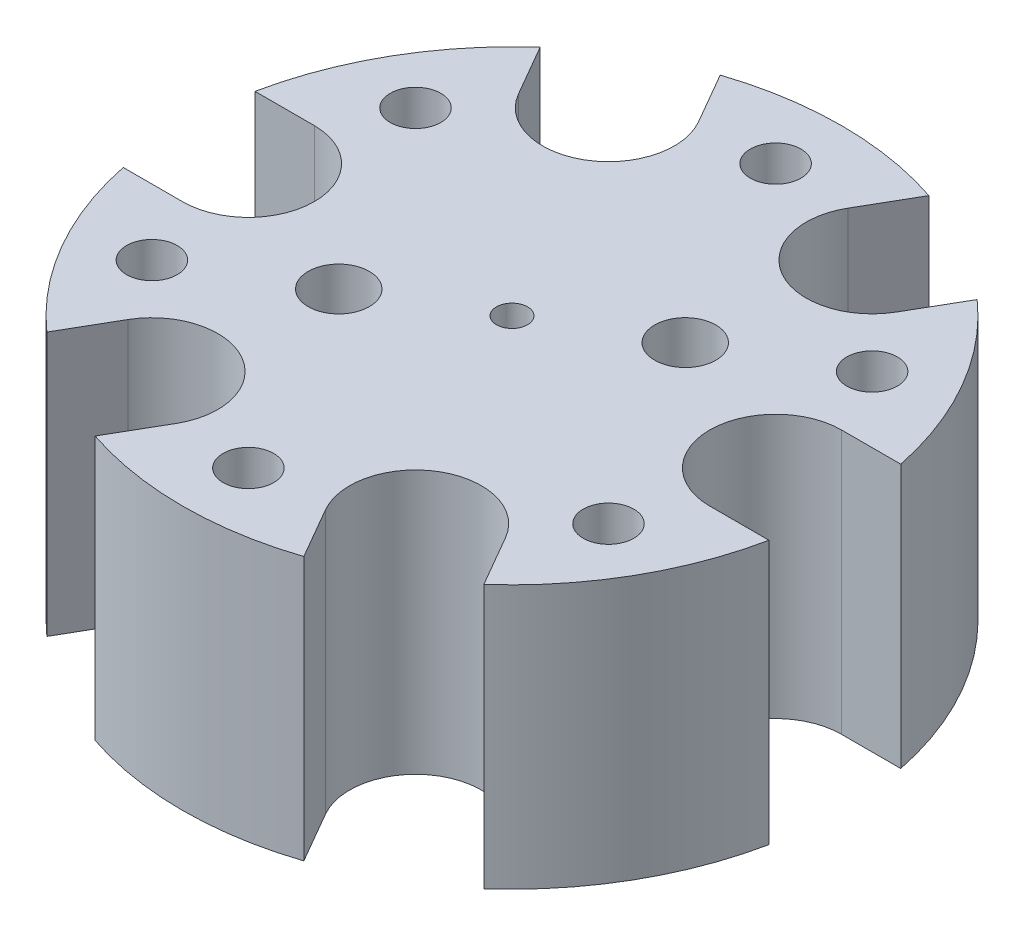
ISO-10303-21;
HEADER;
FILE_DESCRIPTION(('STEP AP214'),'2;1');
FILE_NAME('part.step','',(''),(''),'','','');
FILE_SCHEMA(('AUTOMOTIVE_DESIGN { 1 0 10303 214 1 1 1 1 }'));
ENDSEC;
DATA;
#1=APPLICATION_CONTEXT('core data for automotive mechanical design processes');
#2=APPLICATION_PROTOCOL_DEFINITION('international standard','automotive_design',2000,#1);
#3=PRODUCT_CONTEXT('',#1,'mechanical');
#4=PRODUCT('Part','Part','',(#3));
#5=PRODUCT_RELATED_PRODUCT_CATEGORY('part','',(#4));
#6=PRODUCT_DEFINITION_FORMATION('','',#4);
#7=PRODUCT_DEFINITION_CONTEXT('part definition',#1,'design');
#8=PRODUCT_DEFINITION('design','',#6,#7);
#9=PRODUCT_DEFINITION_SHAPE('','',#8);
#10=(LENGTH_UNIT() NAMED_UNIT(*) SI_UNIT(.MILLI.,.METRE.));
#11=(NAMED_UNIT(*) PLANE_ANGLE_UNIT() SI_UNIT($,.RADIAN.));
#12=(NAMED_UNIT(*) SI_UNIT($,.STERADIAN.) SOLID_ANGLE_UNIT());
#13=UNCERTAINTY_MEASURE_WITH_UNIT(LENGTH_MEASURE(1.E-05),#10,'distance_accuracy_value','');
#14=(GEOMETRIC_REPRESENTATION_CONTEXT(3) GLOBAL_UNCERTAINTY_ASSIGNED_CONTEXT((#13)) GLOBAL_UNIT_ASSIGNED_CONTEXT((#10,
#11,#12)) REPRESENTATION_CONTEXT('',''));
#15=CARTESIAN_POINT('',(0.,0.,0.));
#16=DIRECTION('',(0.,0.,1.));
#17=DIRECTION('',(1.,0.,0.));
#18=AXIS2_PLACEMENT_3D('',#15,#16,#17);
#19=CARTESIAN_POINT('',(0.,12.7,0.));
#20=DIRECTION('',(0.,-1.,0.));
#21=DIRECTION('',(0.,0.,-1.));
#22=AXIS2_PLACEMENT_3D('',#19,#20,#21);
#23=CYLINDRICAL_SURFACE('',#22,15.875);
#24=DIRECTION('',(0.,-1.,0.));
#25=VECTOR('',#24,1.);
#26=CARTESIAN_POINT('',(5.02749927632117,12.7,-15.0578841816037));
#27=LINE('',#26,#25);
#28=CARTESIAN_POINT('',(5.02749927632117,0.,-15.0578841816037));
#29=VERTEX_POINT('',#28);
#30=CARTESIAN_POINT('',(5.02749927632117,12.7,-15.0578841816037));
#31=VERTEX_POINT('',#30);
#32=EDGE_CURVE('E214',#29,#31,#27,.F.);
#33=ORIENTED_EDGE('',*,*,#32,.F.);
#34=CARTESIAN_POINT('',(0.,0.,0.));
#35=DIRECTION('',(0.,1.,0.));
#36=DIRECTION('',(0.,0.,1.));
#37=AXIS2_PLACEMENT_3D('',#34,#35,#36);
#38=CIRCLE('',#37,15.875);
#39=CARTESIAN_POINT('',(-5.02749927632086,0.,-15.0578841816038));
#40=VERTEX_POINT('',#39);
#41=EDGE_CURVE('E425',#29,#40,#38,.T.);
#42=ORIENTED_EDGE('',*,*,#41,.T.);
#43=DIRECTION('',(0.,-1.,0.));
#44=VECTOR('',#43,1.);
#45=CARTESIAN_POINT('',(-5.02749927632086,12.7,-15.0578841816038));
#46=LINE('',#45,#44);
#47=CARTESIAN_POINT('',(-5.02749927632086,12.7,-15.0578841816038));
#48=VERTEX_POINT('',#47);
#49=EDGE_CURVE('E258',#40,#48,#46,.F.);
#50=ORIENTED_EDGE('',*,*,#49,.T.);
#51=CARTESIAN_POINT('',(0.,12.7,0.));
#52=DIRECTION('',(0.,1.,0.));
#53=DIRECTION('',(0.,0.,1.));
#54=AXIS2_PLACEMENT_3D('',#51,#52,#53);
#55=CIRCLE('',#54,15.875);
#56=EDGE_CURVE('E419',#31,#48,#55,.T.);
#57=ORIENTED_EDGE('',*,*,#56,.F.);
#58=EDGE_LOOP('',(#33,#42,#50,#57));
#59=FACE_BOUND('',#58,.T.);
#60=ADVANCED_FACE('F38',(#59),#23,.T.);
#61=DIRECTION('',(0.,-1.,0.));
#62=VECTOR('',#61,1.);
#63=CARTESIAN_POINT('',(-10.5267605903521,12.7,-11.8828841816038));
#64=LINE('',#63,#62);
#65=CARTESIAN_POINT('',(-10.5267605903521,0.,-11.8828841816038));
#66=VERTEX_POINT('',#65);
#67=CARTESIAN_POINT('',(-10.5267605903521,12.7,-11.8828841816038));
#68=VERTEX_POINT('',#67);
#69=EDGE_CURVE('E253',#66,#68,#64,.F.);
#70=ORIENTED_EDGE('',*,*,#69,.F.);
#71=CARTESIAN_POINT('',(-15.5542598666732,0.,-3.175));
#72=VERTEX_POINT('',#71);
#73=EDGE_CURVE('E530',#66,#72,#38,.T.);
#74=ORIENTED_EDGE('',*,*,#73,.T.);
#75=DIRECTION('',(0.,-1.,0.));
#76=VECTOR('',#75,1.);
#77=CARTESIAN_POINT('',(-15.5542598666732,12.7,-3.175));
#78=LINE('',#77,#76);
#79=CARTESIAN_POINT('',(-15.5542598666732,12.7,-3.175));
#80=VERTEX_POINT('',#79);
#81=EDGE_CURVE('E283',#72,#80,#78,.F.);
#82=ORIENTED_EDGE('',*,*,#81,.T.);
#83=EDGE_CURVE('E495',#68,#80,#55,.T.);
#84=ORIENTED_EDGE('',*,*,#83,.F.);
#85=EDGE_LOOP('',(#70,#74,#82,#84));
#86=FACE_BOUND('',#85,.T.);
#87=ADVANCED_FACE('F541',(#86),#23,.T.);
#88=DIRECTION('',(0.,-1.,0.));
#89=VECTOR('',#88,1.);
#90=CARTESIAN_POINT('',(-15.5542598666732,12.7,3.175));
#91=LINE('',#90,#89);
#92=CARTESIAN_POINT('',(-15.5542598666732,0.,3.175));
#93=VERTEX_POINT('',#92);
#94=CARTESIAN_POINT('',(-15.5542598666732,12.7,3.175));
#95=VERTEX_POINT('',#94);
#96=EDGE_CURVE('E278',#93,#95,#91,.F.);
#97=ORIENTED_EDGE('',*,*,#96,.F.);
#98=CARTESIAN_POINT('',(-10.5267605903522,0.,11.8828841816037));
#99=VERTEX_POINT('',#98);
#100=EDGE_CURVE('E524',#93,#99,#38,.T.);
#101=ORIENTED_EDGE('',*,*,#100,.T.);
#102=DIRECTION('',(0.,-1.,0.));
#103=VECTOR('',#102,1.);
#104=CARTESIAN_POINT('',(-10.5267605903522,12.7,11.8828841816037));
#105=LINE('',#104,#103);
#106=CARTESIAN_POINT('',(-10.5267605903522,12.7,11.8828841816037));
#107=VERTEX_POINT('',#106);
#108=EDGE_CURVE('E308',#99,#107,#105,.F.);
#109=ORIENTED_EDGE('',*,*,#108,.T.);
#110=EDGE_CURVE('E497',#95,#107,#55,.T.);
#111=ORIENTED_EDGE('',*,*,#110,.F.);
#112=EDGE_LOOP('',(#97,#101,#109,#111));
#113=FACE_BOUND('',#112,.T.);
#114=ADVANCED_FACE('F553',(#113),#23,.T.);
#115=DIRECTION('',(0.,-1.,0.));
#116=VECTOR('',#115,1.);
#117=CARTESIAN_POINT('',(-5.02749927632107,12.7,15.0578841816037));
#118=LINE('',#117,#116);
#119=CARTESIAN_POINT('',(-5.02749927632107,0.,15.0578841816037));
#120=VERTEX_POINT('',#119);
#121=CARTESIAN_POINT('',(-5.02749927632107,12.7,15.0578841816037));
#122=VERTEX_POINT('',#121);
#123=EDGE_CURVE('E303',#120,#122,#118,.F.);
#124=ORIENTED_EDGE('',*,*,#123,.F.);
#125=CARTESIAN_POINT('',(5.02749927632096,0.,15.0578841816037));
#126=VERTEX_POINT('',#125);
#127=EDGE_CURVE('E522',#120,#126,#38,.T.);
#128=ORIENTED_EDGE('',*,*,#127,.T.);
#129=DIRECTION('',(0.,-1.,0.));
#130=VECTOR('',#129,1.);
#131=CARTESIAN_POINT('',(5.02749927632096,12.7,15.0578841816037));
#132=LINE('',#131,#130);
#133=CARTESIAN_POINT('',(5.02749927632096,12.7,15.0578841816037));
#134=VERTEX_POINT('',#133);
#135=EDGE_CURVE('E333',#126,#134,#132,.F.);
#136=ORIENTED_EDGE('',*,*,#135,.T.);
#137=EDGE_CURVE('E501',#122,#134,#55,.T.);
#138=ORIENTED_EDGE('',*,*,#137,.F.);
#139=EDGE_LOOP('',(#124,#128,#136,#138));
#140=FACE_BOUND('',#139,.T.);
#141=ADVANCED_FACE('F564',(#140),#23,.T.);
#142=DIRECTION('',(0.,-1.,0.));
#143=VECTOR('',#142,1.);
#144=CARTESIAN_POINT('',(10.5267605903522,12.7,11.8828841816038));
#145=LINE('',#144,#143);
#146=CARTESIAN_POINT('',(10.5267605903522,0.,11.8828841816038));
#147=VERTEX_POINT('',#146);
#148=CARTESIAN_POINT('',(10.5267605903522,12.7,11.8828841816038));
#149=VERTEX_POINT('',#148);
#150=EDGE_CURVE('E328',#147,#149,#145,.F.);
#151=ORIENTED_EDGE('',*,*,#150,.F.);
#152=CARTESIAN_POINT('',(15.5542598666732,0.,3.175));
#153=VERTEX_POINT('',#152);
#154=EDGE_CURVE('E426',#147,#153,#38,.T.);
#155=ORIENTED_EDGE('',*,*,#154,.T.);
#156=DIRECTION('',(0.,-1.,0.));
#157=VECTOR('',#156,1.);
#158=CARTESIAN_POINT('',(15.5542598666732,12.7,3.175));
#159=LINE('',#158,#157);
#160=CARTESIAN_POINT('',(15.5542598666732,12.7,3.175));
#161=VERTEX_POINT('',#160);
#162=EDGE_CURVE('E398',#153,#161,#159,.F.);
#163=ORIENTED_EDGE('',*,*,#162,.T.);
#164=EDGE_CURVE('E420',#149,#161,#55,.T.);
#165=ORIENTED_EDGE('',*,*,#164,.F.);
#166=EDGE_LOOP('',(#151,#155,#163,#165));
#167=FACE_BOUND('',#166,.T.);
#168=ADVANCED_FACE('F518',(#167),#23,.T.);
#169=CARTESIAN_POINT('',(15.5542598666732,0.,-3.175));
#170=VERTEX_POINT('',#169);
#171=CARTESIAN_POINT('',(10.5267605903523,0.,-11.8828841816036));
#172=VERTEX_POINT('',#171);
#173=EDGE_CURVE('E421',#170,#172,#38,.T.);
#174=ORIENTED_EDGE('',*,*,#173,.T.);
#175=DIRECTION('',(0.,-1.,0.));
#176=VECTOR('',#175,1.);
#177=CARTESIAN_POINT('',(10.5267605903523,12.7,-11.8828841816036));
#178=LINE('',#177,#176);
#179=CARTESIAN_POINT('',(10.5267605903523,12.7,-11.8828841816036));
#180=VERTEX_POINT('',#179);
#181=EDGE_CURVE('E235',#172,#180,#178,.F.);
#182=ORIENTED_EDGE('',*,*,#181,.T.);
#183=CARTESIAN_POINT('',(15.5542598666732,12.7,-3.175));
#184=VERTEX_POINT('',#183);
#185=EDGE_CURVE('E415',#184,#180,#55,.T.);
#186=ORIENTED_EDGE('',*,*,#185,.F.);
#187=DIRECTION('',(0.,-1.,0.));
#188=VECTOR('',#187,1.);
#189=CARTESIAN_POINT('',(15.5542598666732,12.7,-3.175));
#190=LINE('',#189,#188);
#191=EDGE_CURVE('E393',#170,#184,#190,.F.);
#192=ORIENTED_EDGE('',*,*,#191,.F.);
#193=EDGE_LOOP('',(#174,#182,#186,#192));
#194=FACE_BOUND('',#193,.T.);
#195=ADVANCED_FACE('F40',(#194),#23,.T.);
#196=CARTESIAN_POINT('',(0.,12.7,0.));
#197=DIRECTION('',(0.,1.,0.));
#198=DIRECTION('',(0.,0.,1.));
#199=AXIS2_PLACEMENT_3D('',#196,#197,#198);
#200=PLANE('',#199);
#201=CARTESIAN_POINT('',(-5.29141521712296,12.7,3.05499999999993));
#202=DIRECTION('',(0.,-1.,0.));
#203=DIRECTION('',(0.,0.,-1.));
#204=AXIS2_PLACEMENT_3D('',#201,#202,#203);
#205=CIRCLE('',#204,1.4732);
#206=CARTESIAN_POINT('',(-5.29141521712296,12.7,1.58179999999993));
#207=VERTEX_POINT('',#206);
#208=EDGE_CURVE('E735',#207,#207,#205,.T.);
#209=ORIENTED_EDGE('',*,*,#208,.T.);
#210=EDGE_LOOP('',(#209));
#211=FACE_BOUND('',#210,.T.);
#212=CARTESIAN_POINT('',(5.29141521712292,12.7,-3.05500000000001));
#213=DIRECTION('',(0.,-1.,0.));
#214=DIRECTION('',(0.,0.,-1.));
#215=AXIS2_PLACEMENT_3D('',#212,#213,#214);
#216=CIRCLE('',#215,1.4732);
#217=CARTESIAN_POINT('',(5.29141521712292,12.7,-4.52820000000001));
#218=VERTEX_POINT('',#217);
#219=EDGE_CURVE('E218',#218,#218,#216,.T.);
#220=ORIENTED_EDGE('',*,*,#219,.T.);
#221=EDGE_LOOP('',(#220));
#222=FACE_BOUND('',#221,.T.);
#223=DIRECTION('',(0.50000000000001,0.,-0.866025403784433));
#224=VECTOR('',#223,1.);
#225=CARTESIAN_POINT('',(2.74963065701558,12.7,1.58750000000003));
#226=LINE('',#225,#224);
#227=CARTESIAN_POINT('',(9.0996306570157,12.7,-9.41102262806226));
#228=VERTEX_POINT('',#227);
#229=EDGE_CURVE('E208',#228,#180,#226,.T.);
#230=ORIENTED_EDGE('',*,*,#229,.F.);
#231=CARTESIAN_POINT('',(6.35000000000013,12.7,-10.9985226280623));
#232=DIRECTION('',(0.,1.,0.));
#233=DIRECTION('',(0.866025403784433,0.,0.50000000000001));
#234=AXIS2_PLACEMENT_3D('',#231,#232,#233);
#235=CIRCLE('',#234,3.175);
#236=CARTESIAN_POINT('',(3.60036934298455,12.7,-12.5860226280623));
#237=VERTEX_POINT('',#236);
#238=EDGE_CURVE('E202',#237,#228,#235,.T.);
#239=ORIENTED_EDGE('',*,*,#238,.F.);
#240=DIRECTION('',(0.50000000000001,0.,-0.866025403784433));
#241=VECTOR('',#240,1.);
#242=CARTESIAN_POINT('',(-2.74963065701558,12.7,-1.58750000000003));
#243=LINE('',#242,#241);
#244=EDGE_CURVE('E211',#237,#31,#243,.T.);
#245=ORIENTED_EDGE('',*,*,#244,.T.);
#246=ORIENTED_EDGE('',*,*,#56,.T.);
#247=DIRECTION('',(-0.499999999999992,0.,-0.866025403784443));
#248=VECTOR('',#247,1.);
#249=CARTESIAN_POINT('',(2.74963065701561,12.7,-1.58749999999997));
#250=LINE('',#249,#248);
#251=CARTESIAN_POINT('',(-3.60036934298429,12.7,-12.5860226280624));
#252=VERTEX_POINT('',#251);
#253=EDGE_CURVE('E247',#252,#48,#250,.T.);
#254=ORIENTED_EDGE('',*,*,#253,.F.);
#255=CARTESIAN_POINT('',(-6.3499999999999,12.7,-10.9985226280624));
#256=DIRECTION('',(0.,1.,0.));
#257=DIRECTION('',(0.866025403784443,0.,-0.499999999999992));
#258=AXIS2_PLACEMENT_3D('',#255,#256,#257);
#259=CIRCLE('',#258,3.175);
#260=CARTESIAN_POINT('',(-9.0996306570155,12.7,-9.41102262806245));
#261=VERTEX_POINT('',#260);
#262=EDGE_CURVE('E243',#261,#252,#259,.T.);
#263=ORIENTED_EDGE('',*,*,#262,.F.);
#264=DIRECTION('',(-0.499999999999992,0.,-0.866025403784443));
#265=VECTOR('',#264,1.);
#266=CARTESIAN_POINT('',(-2.74963065701561,12.7,1.58749999999997));
#267=LINE('',#266,#265);
#268=EDGE_CURVE('E239',#261,#68,#267,.T.);
#269=ORIENTED_EDGE('',*,*,#268,.T.);
#270=ORIENTED_EDGE('',*,*,#83,.T.);
#271=DIRECTION('',(-1.,0.,0.));
#272=VECTOR('',#271,1.);
#273=CARTESIAN_POINT('',(0.,12.7,-3.175));
#274=LINE('',#273,#272);
#275=CARTESIAN_POINT('',(-12.7,12.7,-3.175));
#276=VERTEX_POINT('',#275);
#277=EDGE_CURVE('E270',#276,#80,#274,.T.);
#278=ORIENTED_EDGE('',*,*,#277,.F.);
#279=CARTESIAN_POINT('',(-12.7,12.7,0.));
#280=DIRECTION('',(0.,1.,0.));
#281=DIRECTION('',(0.,0.,-1.));
#282=AXIS2_PLACEMENT_3D('',#279,#280,#281);
#283=CIRCLE('',#282,3.175);
#284=CARTESIAN_POINT('',(-12.7,12.7,3.175));
#285=VERTEX_POINT('',#284);
#286=EDGE_CURVE('E266',#285,#276,#283,.T.);
#287=ORIENTED_EDGE('',*,*,#286,.F.);
#288=DIRECTION('',(-1.,0.,0.));
#289=VECTOR('',#288,1.);
#290=CARTESIAN_POINT('',(0.,12.7,3.175));
#291=LINE('',#290,#289);
#292=EDGE_CURVE('E262',#285,#95,#291,.T.);
#293=ORIENTED_EDGE('',*,*,#292,.T.);
#294=ORIENTED_EDGE('',*,*,#110,.T.);
#295=DIRECTION('',(-0.500000000000004,0.,0.866025403784436));
#296=VECTOR('',#295,1.);
#297=CARTESIAN_POINT('',(-2.74963065701559,12.7,-1.58750000000001));
#298=LINE('',#297,#296);
#299=CARTESIAN_POINT('',(-9.09963065701564,12.7,9.41102262806233));
#300=VERTEX_POINT('',#299);
#301=EDGE_CURVE('E295',#300,#107,#298,.T.);
#302=ORIENTED_EDGE('',*,*,#301,.F.);
#303=CARTESIAN_POINT('',(-6.35000000000005,12.7,10.9985226280623));
#304=DIRECTION('',(0.,1.,0.));
#305=DIRECTION('',(-0.866025403784436,0.,-0.500000000000004));
#306=AXIS2_PLACEMENT_3D('',#303,#304,#305);
#307=CIRCLE('',#306,3.175);
#308=CARTESIAN_POINT('',(-3.60036934298446,12.7,12.5860226280624));
#309=VERTEX_POINT('',#308);
#310=EDGE_CURVE('E291',#309,#300,#307,.T.);
#311=ORIENTED_EDGE('',*,*,#310,.F.);
#312=DIRECTION('',(-0.500000000000004,0.,0.866025403784436));
#313=VECTOR('',#312,1.);
#314=CARTESIAN_POINT('',(2.74963065701559,12.7,1.58750000000001));
#315=LINE('',#314,#313);
#316=EDGE_CURVE('E287',#309,#122,#315,.T.);
#317=ORIENTED_EDGE('',*,*,#316,.T.);
#318=ORIENTED_EDGE('',*,*,#137,.T.);
#319=DIRECTION('',(0.499999999999998,0.,0.86602540378444));
#320=VECTOR('',#319,1.);
#321=CARTESIAN_POINT('',(-2.7496306570156,12.7,1.5875));
#322=LINE('',#321,#320);
#323=CARTESIAN_POINT('',(3.60036934298438,12.7,12.5860226280624));
#324=VERTEX_POINT('',#323);
#325=EDGE_CURVE('E320',#324,#134,#322,.T.);
#326=ORIENTED_EDGE('',*,*,#325,.F.);
#327=CARTESIAN_POINT('',(6.34999999999997,12.7,10.9985226280624));
#328=DIRECTION('',(0.,1.,0.));
#329=DIRECTION('',(-0.86602540378444,0.,0.499999999999998));
#330=AXIS2_PLACEMENT_3D('',#327,#328,#329);
#331=CIRCLE('',#330,3.175);
#332=CARTESIAN_POINT('',(9.09963065701557,12.7,9.41102262806239));
#333=VERTEX_POINT('',#332);
#334=EDGE_CURVE('E316',#333,#324,#331,.T.);
#335=ORIENTED_EDGE('',*,*,#334,.F.);
#336=DIRECTION('',(0.499999999999998,0.,0.86602540378444));
#337=VECTOR('',#336,1.);
#338=CARTESIAN_POINT('',(2.7496306570156,12.7,-1.5875));
#339=LINE('',#338,#337);
#340=EDGE_CURVE('E312',#333,#149,#339,.T.);
#341=ORIENTED_EDGE('',*,*,#340,.T.);
#342=ORIENTED_EDGE('',*,*,#164,.T.);
#343=DIRECTION('',(1.,0.,0.));
#344=VECTOR('',#343,1.);
#345=CARTESIAN_POINT('',(0.,12.7,3.175));
#346=LINE('',#345,#344);
#347=CARTESIAN_POINT('',(12.7,12.7,3.175));
#348=VERTEX_POINT('',#347);
#349=EDGE_CURVE('E385',#348,#161,#346,.T.);
#350=ORIENTED_EDGE('',*,*,#349,.F.);
#351=CARTESIAN_POINT('',(12.7,12.7,0.));
#352=DIRECTION('',(0.,1.,0.));
#353=DIRECTION('',(0.,0.,1.));
#354=AXIS2_PLACEMENT_3D('',#351,#352,#353);
#355=CIRCLE('',#354,3.175);
#356=CARTESIAN_POINT('',(12.7,12.7,-3.175));
#357=VERTEX_POINT('',#356);
#358=EDGE_CURVE('E381',#357,#348,#355,.T.);
#359=ORIENTED_EDGE('',*,*,#358,.F.);
#360=DIRECTION('',(1.,0.,0.));
#361=VECTOR('',#360,1.);
#362=CARTESIAN_POINT('',(0.,12.7,-3.175));
#363=LINE('',#362,#361);
#364=EDGE_CURVE('E374',#357,#184,#363,.T.);
#365=ORIENTED_EDGE('',*,*,#364,.T.);
#366=ORIENTED_EDGE('',*,*,#185,.T.);
#367=EDGE_LOOP('',(#230,#239,#245,#246,#254,#263,#269,#270,#278,#287,#293,#294,#302,#311,#317,
#318,#326,#335,#341,#342,#350,#359,#365,#366));
#368=FACE_BOUND('',#367,.T.);
#369=CARTESIAN_POINT('',(-10.9985226280623,12.7,-6.35000000000013));
#370=DIRECTION('',(0.,1.,0.));
#371=DIRECTION('',(0.866025403784433,0.,0.50000000000001));
#372=AXIS2_PLACEMENT_3D('',#369,#370,#371);
#373=CIRCLE('',#372,1.2192);
#374=CARTESIAN_POINT('',(-9.94266445576832,12.7,-5.74040000000012));
#375=VERTEX_POINT('',#374);
#376=EDGE_CURVE('E337',#375,#375,#373,.T.);
#377=ORIENTED_EDGE('',*,*,#376,.F.);
#378=EDGE_LOOP('',(#377));
#379=FACE_BOUND('',#378,.T.);
#380=CARTESIAN_POINT('',(-10.9985226280624,12.7,6.3499999999999));
#381=DIRECTION('',(0.,1.,0.));
#382=DIRECTION('',(0.866025403784443,0.,-0.499999999999992));
#383=AXIS2_PLACEMENT_3D('',#380,#381,#382);
#384=CIRCLE('',#383,1.2192);
#385=CARTESIAN_POINT('',(-9.94266445576844,12.7,5.74039999999991));
#386=VERTEX_POINT('',#385);
#387=EDGE_CURVE('E342',#386,#386,#384,.T.);
#388=ORIENTED_EDGE('',*,*,#387,.F.);
#389=EDGE_LOOP('',(#388));
#390=FACE_BOUND('',#389,.T.);
#391=CARTESIAN_POINT('',(0.,12.7,12.7));
#392=DIRECTION('',(0.,1.,0.));
#393=DIRECTION('',(0.,0.,-1.));
#394=AXIS2_PLACEMENT_3D('',#391,#392,#393);
#395=CIRCLE('',#394,1.2192);
#396=CARTESIAN_POINT('',(0.,12.7,11.4808));
#397=VERTEX_POINT('',#396);
#398=EDGE_CURVE('E350',#397,#397,#395,.T.);
#399=ORIENTED_EDGE('',*,*,#398,.F.);
#400=EDGE_LOOP('',(#399));
#401=FACE_BOUND('',#400,.T.);
#402=CARTESIAN_POINT('',(10.9985226280623,12.7,6.35000000000005));
#403=DIRECTION('',(0.,1.,0.));
#404=DIRECTION('',(-0.866025403784436,0.,-0.500000000000004));
#405=AXIS2_PLACEMENT_3D('',#402,#403,#404);
#406=CIRCLE('',#405,1.2192);
#407=CARTESIAN_POINT('',(9.94266445576836,12.7,5.74040000000005));
#408=VERTEX_POINT('',#407);
#409=EDGE_CURVE('E358',#408,#408,#406,.T.);
#410=ORIENTED_EDGE('',*,*,#409,.F.);
#411=EDGE_LOOP('',(#410));
#412=FACE_BOUND('',#411,.T.);
#413=CARTESIAN_POINT('',(10.9985226280624,12.7,-6.34999999999997));
#414=DIRECTION('',(0.,1.,0.));
#415=DIRECTION('',(-0.86602540378444,0.,0.499999999999998));
#416=AXIS2_PLACEMENT_3D('',#413,#414,#415);
#417=CIRCLE('',#416,1.2192);
#418=CARTESIAN_POINT('',(9.9426644557684,12.7,-5.74039999999998));
#419=VERTEX_POINT('',#418);
#420=EDGE_CURVE('E366',#419,#419,#417,.T.);
#421=ORIENTED_EDGE('',*,*,#420,.F.);
#422=EDGE_LOOP('',(#421));
#423=FACE_BOUND('',#422,.T.);
#424=CARTESIAN_POINT('',(0.,12.7,-12.7));
#425=DIRECTION('',(0.,1.,0.));
#426=DIRECTION('',(0.,0.,1.));
#427=AXIS2_PLACEMENT_3D('',#424,#425,#426);
#428=CIRCLE('',#427,1.2192);
#429=CARTESIAN_POINT('',(0.,12.7,-11.4808));
#430=VERTEX_POINT('',#429);
#431=EDGE_CURVE('E402',#430,#430,#428,.T.);
#432=ORIENTED_EDGE('',*,*,#431,.F.);
#433=EDGE_LOOP('',(#432));
#434=FACE_BOUND('',#433,.T.);
#435=CARTESIAN_POINT('',(0.,12.7,0.));
#436=DIRECTION('',(0.,1.,0.));
#437=DIRECTION('',(0.,0.,1.));
#438=AXIS2_PLACEMENT_3D('',#435,#436,#437);
#439=CIRCLE('',#438,0.7493);
#440=CARTESIAN_POINT('',(0.,12.7,0.7493));
#441=VERTEX_POINT('',#440);
#442=EDGE_CURVE('E407',#441,#441,#439,.T.);
#443=ORIENTED_EDGE('',*,*,#442,.F.);
#444=EDGE_LOOP('',(#443));
#445=FACE_BOUND('',#444,.T.);
#446=ADVANCED_FACE('F220',(#211,#222,#368,#379,#390,#401,#412,#423,#434,#445),#200,.T.);
#447=CARTESIAN_POINT('',(0.,0.,0.));
#448=DIRECTION('',(0.,1.,0.));
#449=DIRECTION('',(0.,0.,1.));
#450=AXIS2_PLACEMENT_3D('',#447,#448,#449);
#451=PLANE('',#450);
#452=CARTESIAN_POINT('',(-5.29141521712296,0.,3.05499999999993));
#453=DIRECTION('',(0.,-1.,0.));
#454=DIRECTION('',(0.,0.,-1.));
#455=AXIS2_PLACEMENT_3D('',#452,#453,#454);
#456=CIRCLE('',#455,1.47319999999999);
#457=CARTESIAN_POINT('',(-5.29141521712296,0.,1.58179999999994));
#458=VERTEX_POINT('',#457);
#459=EDGE_CURVE('E628',#458,#458,#456,.T.);
#460=ORIENTED_EDGE('',*,*,#459,.F.);
#461=EDGE_LOOP('',(#460));
#462=FACE_BOUND('',#461,.T.);
#463=CARTESIAN_POINT('',(5.29141521712292,0.,-3.05500000000001));
#464=DIRECTION('',(0.,-1.,0.));
#465=DIRECTION('',(0.,0.,-1.));
#466=AXIS2_PLACEMENT_3D('',#463,#464,#465);
#467=CIRCLE('',#466,1.47319999999999);
#468=CARTESIAN_POINT('',(5.29141521712292,0.,-4.5282));
#469=VERTEX_POINT('',#468);
#470=EDGE_CURVE('E632',#469,#469,#467,.T.);
#471=ORIENTED_EDGE('',*,*,#470,.F.);
#472=EDGE_LOOP('',(#471));
#473=FACE_BOUND('',#472,.T.);
#474=CARTESIAN_POINT('',(-10.9985226280623,0.,-6.35000000000013));
#475=DIRECTION('',(0.,1.,0.));
#476=DIRECTION('',(0.866025403784433,0.,0.50000000000001));
#477=AXIS2_PLACEMENT_3D('',#474,#475,#476);
#478=CIRCLE('',#477,1.2192);
#479=CARTESIAN_POINT('',(-9.94266445576832,0.,-5.74040000000012));
#480=VERTEX_POINT('',#479);
#481=EDGE_CURVE('E338',#480,#480,#478,.T.);
#482=ORIENTED_EDGE('',*,*,#481,.T.);
#483=EDGE_LOOP('',(#482));
#484=FACE_BOUND('',#483,.T.);
#485=CARTESIAN_POINT('',(-10.9985226280624,0.,6.3499999999999));
#486=DIRECTION('',(0.,1.,0.));
#487=DIRECTION('',(0.866025403784443,0.,-0.499999999999992));
#488=AXIS2_PLACEMENT_3D('',#485,#486,#487);
#489=CIRCLE('',#488,1.2192);
#490=CARTESIAN_POINT('',(-9.94266445576844,0.,5.74039999999991));
#491=VERTEX_POINT('',#490);
#492=EDGE_CURVE('E346',#491,#491,#489,.T.);
#493=ORIENTED_EDGE('',*,*,#492,.T.);
#494=EDGE_LOOP('',(#493));
#495=FACE_BOUND('',#494,.T.);
#496=CARTESIAN_POINT('',(0.,0.,12.7));
#497=DIRECTION('',(0.,1.,0.));
#498=DIRECTION('',(0.,0.,-1.));
#499=AXIS2_PLACEMENT_3D('',#496,#497,#498);
#500=CIRCLE('',#499,1.2192);
#501=CARTESIAN_POINT('',(0.,0.,11.4808));
#502=VERTEX_POINT('',#501);
#503=EDGE_CURVE('E354',#502,#502,#500,.T.);
#504=ORIENTED_EDGE('',*,*,#503,.T.);
#505=EDGE_LOOP('',(#504));
#506=FACE_BOUND('',#505,.T.);
#507=CARTESIAN_POINT('',(10.9985226280623,0.,6.35000000000005));
#508=DIRECTION('',(0.,1.,0.));
#509=DIRECTION('',(-0.866025403784436,0.,-0.500000000000004));
#510=AXIS2_PLACEMENT_3D('',#507,#508,#509);
#511=CIRCLE('',#510,1.2192);
#512=CARTESIAN_POINT('',(9.94266445576836,0.,5.74040000000005));
#513=VERTEX_POINT('',#512);
#514=EDGE_CURVE('E362',#513,#513,#511,.T.);
#515=ORIENTED_EDGE('',*,*,#514,.T.);
#516=EDGE_LOOP('',(#515));
#517=FACE_BOUND('',#516,.T.);
#518=CARTESIAN_POINT('',(10.9985226280624,0.,-6.34999999999997));
#519=DIRECTION('',(0.,1.,0.));
#520=DIRECTION('',(-0.86602540378444,0.,0.499999999999998));
#521=AXIS2_PLACEMENT_3D('',#518,#519,#520);
#522=CIRCLE('',#521,1.2192);
#523=CARTESIAN_POINT('',(9.9426644557684,0.,-5.74039999999998));
#524=VERTEX_POINT('',#523);
#525=EDGE_CURVE('E370',#524,#524,#522,.T.);
#526=ORIENTED_EDGE('',*,*,#525,.T.);
#527=EDGE_LOOP('',(#526));
#528=FACE_BOUND('',#527,.T.);
#529=CARTESIAN_POINT('',(0.,0.,-12.7));
#530=DIRECTION('',(0.,1.,0.));
#531=DIRECTION('',(0.,0.,1.));
#532=AXIS2_PLACEMENT_3D('',#529,#530,#531);
#533=CIRCLE('',#532,1.2192);
#534=CARTESIAN_POINT('',(0.,0.,-11.4808));
#535=VERTEX_POINT('',#534);
#536=EDGE_CURVE('E403',#535,#535,#533,.T.);
#537=ORIENTED_EDGE('',*,*,#536,.T.);
#538=EDGE_LOOP('',(#537));
#539=FACE_BOUND('',#538,.T.);
#540=CARTESIAN_POINT('',(0.,0.,0.));
#541=DIRECTION('',(0.,1.,0.));
#542=DIRECTION('',(0.,0.,1.));
#543=AXIS2_PLACEMENT_3D('',#540,#541,#542);
#544=CIRCLE('',#543,0.7493);
#545=CARTESIAN_POINT('',(0.,0.,0.7493));
#546=VERTEX_POINT('',#545);
#547=EDGE_CURVE('E414',#546,#546,#544,.T.);
#548=ORIENTED_EDGE('',*,*,#547,.T.);
#549=EDGE_LOOP('',(#548));
#550=FACE_BOUND('',#549,.T.);
#551=CARTESIAN_POINT('',(6.35000000000013,0.,-10.9985226280623));
#552=DIRECTION('',(0.,1.,0.));
#553=DIRECTION('',(0.,0.,1.));
#554=AXIS2_PLACEMENT_3D('',#551,#552,#553);
#555=CIRCLE('',#554,3.175);
#556=CARTESIAN_POINT('',(3.60036934298455,0.,-12.5860226280623));
#557=VERTEX_POINT('',#556);
#558=CARTESIAN_POINT('',(9.0996306570157,0.,-9.41102262806226));
#559=VERTEX_POINT('',#558);
#560=EDGE_CURVE('E47',#557,#559,#555,.T.);
#561=ORIENTED_EDGE('',*,*,#560,.T.);
#562=DIRECTION('',(0.50000000000001,0.,-0.866025403784433));
#563=VECTOR('',#562,1.);
#564=CARTESIAN_POINT('',(2.74963065701558,0.,1.58750000000003));
#565=LINE('',#564,#563);
#566=EDGE_CURVE('E11',#559,#172,#565,.T.);
#567=ORIENTED_EDGE('',*,*,#566,.T.);
#568=ORIENTED_EDGE('',*,*,#173,.F.);
#569=DIRECTION('',(1.,0.,0.));
#570=VECTOR('',#569,1.);
#571=CARTESIAN_POINT('',(0.,0.,-3.175));
#572=LINE('',#571,#570);
#573=CARTESIAN_POINT('',(12.7,0.,-3.175));
#574=VERTEX_POINT('',#573);
#575=EDGE_CURVE('E418',#574,#170,#572,.T.);
#576=ORIENTED_EDGE('',*,*,#575,.F.);
#577=CARTESIAN_POINT('',(12.7,0.,0.));
#578=DIRECTION('',(0.,1.,0.));
#579=DIRECTION('',(0.,0.,1.));
#580=AXIS2_PLACEMENT_3D('',#577,#578,#579);
#581=CIRCLE('',#580,3.175);
#582=CARTESIAN_POINT('',(12.7,0.,3.175));
#583=VERTEX_POINT('',#582);
#584=EDGE_CURVE('E432',#574,#583,#581,.T.);
#585=ORIENTED_EDGE('',*,*,#584,.T.);
#586=DIRECTION('',(1.,0.,0.));
#587=VECTOR('',#586,1.);
#588=CARTESIAN_POINT('',(0.,0.,3.175));
#589=LINE('',#588,#587);
#590=EDGE_CURVE('E436',#583,#153,#589,.T.);
#591=ORIENTED_EDGE('',*,*,#590,.T.);
#592=ORIENTED_EDGE('',*,*,#154,.F.);
#593=DIRECTION('',(0.499999999999998,0.,0.86602540378444));
#594=VECTOR('',#593,1.);
#595=CARTESIAN_POINT('',(2.7496306570156,0.,-1.5875));
#596=LINE('',#595,#594);
#597=CARTESIAN_POINT('',(9.09963065701557,0.,9.41102262806239));
#598=VERTEX_POINT('',#597);
#599=EDGE_CURVE('E440',#598,#147,#596,.T.);
#600=ORIENTED_EDGE('',*,*,#599,.F.);
#601=CARTESIAN_POINT('',(6.34999999999997,0.,10.9985226280624));
#602=DIRECTION('',(0.,1.,0.));
#603=DIRECTION('',(0.,0.,1.));
#604=AXIS2_PLACEMENT_3D('',#601,#602,#603);
#605=CIRCLE('',#604,3.175);
#606=CARTESIAN_POINT('',(3.60036934298438,0.,12.5860226280624));
#607=VERTEX_POINT('',#606);
#608=EDGE_CURVE('E443',#598,#607,#605,.T.);
#609=ORIENTED_EDGE('',*,*,#608,.T.);
#610=DIRECTION('',(0.499999999999998,0.,0.86602540378444));
#611=VECTOR('',#610,1.);
#612=CARTESIAN_POINT('',(-2.7496306570156,0.,1.5875));
#613=LINE('',#612,#611);
#614=EDGE_CURVE('E447',#607,#126,#613,.T.);
#615=ORIENTED_EDGE('',*,*,#614,.T.);
#616=ORIENTED_EDGE('',*,*,#127,.F.);
#617=DIRECTION('',(-0.500000000000004,0.,0.866025403784436));
#618=VECTOR('',#617,1.);
#619=CARTESIAN_POINT('',(2.74963065701559,0.,1.58750000000001));
#620=LINE('',#619,#618);
#621=CARTESIAN_POINT('',(-3.60036934298446,0.,12.5860226280624));
#622=VERTEX_POINT('',#621);
#623=EDGE_CURVE('E451',#622,#120,#620,.T.);
#624=ORIENTED_EDGE('',*,*,#623,.F.);
#625=CARTESIAN_POINT('',(-6.35000000000005,0.,10.9985226280623));
#626=DIRECTION('',(0.,1.,0.));
#627=DIRECTION('',(0.,0.,1.));
#628=AXIS2_PLACEMENT_3D('',#625,#626,#627);
#629=CIRCLE('',#628,3.175);
#630=CARTESIAN_POINT('',(-9.09963065701564,0.,9.41102262806233));
#631=VERTEX_POINT('',#630);
#632=EDGE_CURVE('E454',#622,#631,#629,.T.);
#633=ORIENTED_EDGE('',*,*,#632,.T.);
#634=DIRECTION('',(-0.500000000000004,0.,0.866025403784436));
#635=VECTOR('',#634,1.);
#636=CARTESIAN_POINT('',(-2.74963065701559,0.,-1.58750000000001));
#637=LINE('',#636,#635);
#638=EDGE_CURVE('E458',#631,#99,#637,.T.);
#639=ORIENTED_EDGE('',*,*,#638,.T.);
#640=ORIENTED_EDGE('',*,*,#100,.F.);
#641=DIRECTION('',(-1.,0.,0.));
#642=VECTOR('',#641,1.);
#643=CARTESIAN_POINT('',(0.,0.,3.175));
#644=LINE('',#643,#642);
#645=CARTESIAN_POINT('',(-12.7,0.,3.175));
#646=VERTEX_POINT('',#645);
#647=EDGE_CURVE('E462',#646,#93,#644,.T.);
#648=ORIENTED_EDGE('',*,*,#647,.F.);
#649=CARTESIAN_POINT('',(-12.7,0.,0.));
#650=DIRECTION('',(0.,1.,0.));
#651=DIRECTION('',(0.,0.,1.));
#652=AXIS2_PLACEMENT_3D('',#649,#650,#651);
#653=CIRCLE('',#652,3.175);
#654=CARTESIAN_POINT('',(-12.7,0.,-3.175));
#655=VERTEX_POINT('',#654);
#656=EDGE_CURVE('E465',#646,#655,#653,.T.);
#657=ORIENTED_EDGE('',*,*,#656,.T.);
#658=DIRECTION('',(-1.,0.,0.));
#659=VECTOR('',#658,1.);
#660=CARTESIAN_POINT('',(0.,0.,-3.175));
#661=LINE('',#660,#659);
#662=EDGE_CURVE('E469',#655,#72,#661,.T.);
#663=ORIENTED_EDGE('',*,*,#662,.T.);
#664=ORIENTED_EDGE('',*,*,#73,.F.);
#665=DIRECTION('',(-0.499999999999992,0.,-0.866025403784443));
#666=VECTOR('',#665,1.);
#667=CARTESIAN_POINT('',(-2.74963065701561,0.,1.58749999999997));
#668=LINE('',#667,#666);
#669=CARTESIAN_POINT('',(-9.0996306570155,0.,-9.41102262806245));
#670=VERTEX_POINT('',#669);
#671=EDGE_CURVE('E473',#670,#66,#668,.T.);
#672=ORIENTED_EDGE('',*,*,#671,.F.);
#673=CARTESIAN_POINT('',(-6.3499999999999,0.,-10.9985226280624));
#674=DIRECTION('',(0.,1.,0.));
#675=DIRECTION('',(0.,0.,1.));
#676=AXIS2_PLACEMENT_3D('',#673,#674,#675);
#677=CIRCLE('',#676,3.175);
#678=CARTESIAN_POINT('',(-3.60036934298429,0.,-12.5860226280624));
#679=VERTEX_POINT('',#678);
#680=EDGE_CURVE('E476',#670,#679,#677,.T.);
#681=ORIENTED_EDGE('',*,*,#680,.T.);
#682=DIRECTION('',(-0.499999999999992,0.,-0.866025403784443));
#683=VECTOR('',#682,1.);
#684=CARTESIAN_POINT('',(2.74963065701561,0.,-1.58749999999997));
#685=LINE('',#684,#683);
#686=EDGE_CURVE('E480',#679,#40,#685,.T.);
#687=ORIENTED_EDGE('',*,*,#686,.T.);
#688=ORIENTED_EDGE('',*,*,#41,.F.);
#689=DIRECTION('',(0.50000000000001,0.,-0.866025403784433));
#690=VECTOR('',#689,1.);
#691=CARTESIAN_POINT('',(-2.74963065701558,0.,-1.58750000000003));
#692=LINE('',#691,#690);
#693=EDGE_CURVE('E484',#557,#29,#692,.T.);
#694=ORIENTED_EDGE('',*,*,#693,.F.);
#695=EDGE_LOOP('',(#561,#567,#568,#576,#585,#591,#592,#600,#609,#615,#616,#624,#633,#639,#640,
#648,#657,#663,#664,#672,#681,#687,#688,#694));
#696=FACE_BOUND('',#695,.T.);
#697=ADVANCED_FACE('F488',(#462,#473,#484,#495,#506,#517,#528,#539,#550,#696),#451,.F.);
#698=CARTESIAN_POINT('',(0.,-7.3,0.));
#699=DIRECTION('',(0.,1.,0.));
#700=DIRECTION('',(0.,0.,1.));
#701=AXIS2_PLACEMENT_3D('',#698,#699,#700);
#702=CYLINDRICAL_SURFACE('',#701,0.7493);
#703=ORIENTED_EDGE('',*,*,#442,.T.);
#704=EDGE_LOOP('',(#703));
#705=FACE_BOUND('',#704,.T.);
#706=ORIENTED_EDGE('',*,*,#547,.F.);
#707=EDGE_LOOP('',(#706));
#708=FACE_BOUND('',#707,.T.);
#709=ADVANCED_FACE('F617',(#705,#708),#702,.F.);
#710=CARTESIAN_POINT('',(0.,0.,-12.7));
#711=DIRECTION('',(0.,1.,0.));
#712=DIRECTION('',(0.,0.,1.));
#713=AXIS2_PLACEMENT_3D('',#710,#711,#712);
#714=CYLINDRICAL_SURFACE('',#713,1.2192);
#715=ORIENTED_EDGE('',*,*,#536,.F.);
#716=EDGE_LOOP('',(#715));
#717=FACE_BOUND('',#716,.T.);
#718=ORIENTED_EDGE('',*,*,#431,.T.);
#719=EDGE_LOOP('',(#718));
#720=FACE_BOUND('',#719,.T.);
#721=ADVANCED_FACE('F611',(#717,#720),#714,.F.);
#722=CARTESIAN_POINT('',(0.,-7.3,3.175));
#723=DIRECTION('',(0.,0.,1.));
#724=DIRECTION('',(1.,0.,0.));
#725=AXIS2_PLACEMENT_3D('',#722,#723,#724);
#726=PLANE('',#725);
#727=ORIENTED_EDGE('',*,*,#590,.F.);
#728=DIRECTION('',(0.,1.,0.));
#729=VECTOR('',#728,1.);
#730=CARTESIAN_POINT('',(12.7,-7.3,3.175));
#731=LINE('',#730,#729);
#732=EDGE_CURVE('E390',#583,#348,#731,.T.);
#733=ORIENTED_EDGE('',*,*,#732,.T.);
#734=ORIENTED_EDGE('',*,*,#349,.T.);
#735=ORIENTED_EDGE('',*,*,#162,.F.);
#736=EDGE_LOOP('',(#727,#733,#734,#735));
#737=FACE_BOUND('',#736,.T.);
#738=ADVANCED_FACE('F516',(#737),#726,.F.);
#739=CARTESIAN_POINT('',(12.7,-7.3,0.));
#740=DIRECTION('',(0.,1.,0.));
#741=DIRECTION('',(0.,0.,1.));
#742=AXIS2_PLACEMENT_3D('',#739,#740,#741);
#743=CYLINDRICAL_SURFACE('',#742,3.175);
#744=DIRECTION('',(0.,1.,0.));
#745=VECTOR('',#744,1.);
#746=CARTESIAN_POINT('',(12.7,-7.3,-3.175));
#747=LINE('',#746,#745);
#748=EDGE_CURVE('E389',#574,#357,#747,.T.);
#749=ORIENTED_EDGE('',*,*,#748,.T.);
#750=ORIENTED_EDGE('',*,*,#358,.T.);
#751=ORIENTED_EDGE('',*,*,#732,.F.);
#752=ORIENTED_EDGE('',*,*,#584,.F.);
#753=EDGE_LOOP('',(#749,#750,#751,#752));
#754=FACE_BOUND('',#753,.T.);
#755=ADVANCED_FACE('F602',(#754),#743,.F.);
#756=CARTESIAN_POINT('',(0.,-7.3,-3.175));
#757=DIRECTION('',(0.,0.,1.));
#758=DIRECTION('',(1.,0.,0.));
#759=AXIS2_PLACEMENT_3D('',#756,#757,#758);
#760=PLANE('',#759);
#761=ORIENTED_EDGE('',*,*,#191,.T.);
#762=ORIENTED_EDGE('',*,*,#364,.F.);
#763=ORIENTED_EDGE('',*,*,#748,.F.);
#764=ORIENTED_EDGE('',*,*,#575,.T.);
#765=EDGE_LOOP('',(#761,#762,#763,#764));
#766=FACE_BOUND('',#765,.T.);
#767=ADVANCED_FACE('F599',(#766),#760,.T.);
#768=CARTESIAN_POINT('',(10.9985226280624,0.,-6.34999999999997));
#769=DIRECTION('',(0.,1.,0.));
#770=DIRECTION('',(0.,0.,1.));
#771=AXIS2_PLACEMENT_3D('',#768,#769,#770);
#772=CYLINDRICAL_SURFACE('',#771,1.2192);
#773=ORIENTED_EDGE('',*,*,#525,.F.);
#774=EDGE_LOOP('',(#773));
#775=FACE_BOUND('',#774,.T.);
#776=ORIENTED_EDGE('',*,*,#420,.T.);
#777=EDGE_LOOP('',(#776));
#778=FACE_BOUND('',#777,.T.);
#779=ADVANCED_FACE('F609',(#775,#778),#772,.F.);
#780=CARTESIAN_POINT('',(10.9985226280623,0.,6.35000000000005));
#781=DIRECTION('',(0.,1.,0.));
#782=DIRECTION('',(0.,0.,1.));
#783=AXIS2_PLACEMENT_3D('',#780,#781,#782);
#784=CYLINDRICAL_SURFACE('',#783,1.2192);
#785=ORIENTED_EDGE('',*,*,#514,.F.);
#786=EDGE_LOOP('',(#785));
#787=FACE_BOUND('',#786,.T.);
#788=ORIENTED_EDGE('',*,*,#409,.T.);
#789=EDGE_LOOP('',(#788));
#790=FACE_BOUND('',#789,.T.);
#791=ADVANCED_FACE('F655',(#787,#790),#784,.F.);
#792=CARTESIAN_POINT('',(0.,0.,12.7));
#793=DIRECTION('',(0.,1.,0.));
#794=DIRECTION('',(0.,0.,1.));
#795=AXIS2_PLACEMENT_3D('',#792,#793,#794);
#796=CYLINDRICAL_SURFACE('',#795,1.2192);
#797=ORIENTED_EDGE('',*,*,#503,.F.);
#798=EDGE_LOOP('',(#797));
#799=FACE_BOUND('',#798,.T.);
#800=ORIENTED_EDGE('',*,*,#398,.T.);
#801=EDGE_LOOP('',(#800));
#802=FACE_BOUND('',#801,.T.);
#803=ADVANCED_FACE('F661',(#799,#802),#796,.F.);
#804=CARTESIAN_POINT('',(-10.9985226280624,0.,6.3499999999999));
#805=DIRECTION('',(0.,1.,0.));
#806=DIRECTION('',(0.,0.,1.));
#807=AXIS2_PLACEMENT_3D('',#804,#805,#806);
#808=CYLINDRICAL_SURFACE('',#807,1.2192);
#809=ORIENTED_EDGE('',*,*,#492,.F.);
#810=EDGE_LOOP('',(#809));
#811=FACE_BOUND('',#810,.T.);
#812=ORIENTED_EDGE('',*,*,#387,.T.);
#813=EDGE_LOOP('',(#812));
#814=FACE_BOUND('',#813,.T.);
#815=ADVANCED_FACE('F667',(#811,#814),#808,.F.);
#816=CARTESIAN_POINT('',(-10.9985226280623,0.,-6.35000000000013));
#817=DIRECTION('',(0.,1.,0.));
#818=DIRECTION('',(0.,0.,1.));
#819=AXIS2_PLACEMENT_3D('',#816,#817,#818);
#820=CYLINDRICAL_SURFACE('',#819,1.2192);
#821=ORIENTED_EDGE('',*,*,#481,.F.);
#822=EDGE_LOOP('',(#821));
#823=FACE_BOUND('',#822,.T.);
#824=ORIENTED_EDGE('',*,*,#376,.T.);
#825=EDGE_LOOP('',(#824));
#826=FACE_BOUND('',#825,.T.);
#827=ADVANCED_FACE('F670',(#823,#826),#820,.F.);
#828=CARTESIAN_POINT('',(-2.7496306570156,-7.3,1.5875));
#829=DIRECTION('',(-0.86602540378444,0.,0.499999999999998));
#830=DIRECTION('',(0.499999999999998,0.,0.86602540378444));
#831=AXIS2_PLACEMENT_3D('',#828,#829,#830);
#832=PLANE('',#831);
#833=ORIENTED_EDGE('',*,*,#614,.F.);
#834=DIRECTION('',(0.,1.,0.));
#835=VECTOR('',#834,1.);
#836=CARTESIAN_POINT('',(3.60036934298438,-7.3,12.5860226280624));
#837=LINE('',#836,#835);
#838=EDGE_CURVE('E325',#607,#324,#837,.T.);
#839=ORIENTED_EDGE('',*,*,#838,.T.);
#840=ORIENTED_EDGE('',*,*,#325,.T.);
#841=ORIENTED_EDGE('',*,*,#135,.F.);
#842=EDGE_LOOP('',(#833,#839,#840,#841));
#843=FACE_BOUND('',#842,.T.);
#844=ADVANCED_FACE('F566',(#843),#832,.F.);
#845=CARTESIAN_POINT('',(6.34999999999997,-7.3,10.9985226280624));
#846=DIRECTION('',(0.,1.,0.));
#847=DIRECTION('',(0.,0.,1.));
#848=AXIS2_PLACEMENT_3D('',#845,#846,#847);
#849=CYLINDRICAL_SURFACE('',#848,3.175);
#850=DIRECTION('',(0.,1.,0.));
#851=VECTOR('',#850,1.);
#852=CARTESIAN_POINT('',(9.09963065701557,-7.3,9.41102262806239));
#853=LINE('',#852,#851);
#854=EDGE_CURVE('E324',#598,#333,#853,.T.);
#855=ORIENTED_EDGE('',*,*,#854,.T.);
#856=ORIENTED_EDGE('',*,*,#334,.T.);
#857=ORIENTED_EDGE('',*,*,#838,.F.);
#858=ORIENTED_EDGE('',*,*,#608,.F.);
#859=EDGE_LOOP('',(#855,#856,#857,#858));
#860=FACE_BOUND('',#859,.T.);
#861=ADVANCED_FACE('F570',(#860),#849,.F.);
#862=CARTESIAN_POINT('',(2.7496306570156,-7.3,-1.5875));
#863=DIRECTION('',(-0.86602540378444,0.,0.499999999999998));
#864=DIRECTION('',(0.499999999999998,0.,0.86602540378444));
#865=AXIS2_PLACEMENT_3D('',#862,#863,#864);
#866=PLANE('',#865);
#867=ORIENTED_EDGE('',*,*,#150,.T.);
#868=ORIENTED_EDGE('',*,*,#340,.F.);
#869=ORIENTED_EDGE('',*,*,#854,.F.);
#870=ORIENTED_EDGE('',*,*,#599,.T.);
#871=EDGE_LOOP('',(#867,#868,#869,#870));
#872=FACE_BOUND('',#871,.T.);
#873=ADVANCED_FACE('F572',(#872),#866,.T.);
#874=CARTESIAN_POINT('',(-2.74963065701559,-7.3,-1.58750000000001));
#875=DIRECTION('',(-0.866025403784436,0.,-0.500000000000004));
#876=DIRECTION('',(-0.500000000000004,0.,0.866025403784436));
#877=AXIS2_PLACEMENT_3D('',#874,#875,#876);
#878=PLANE('',#877);
#879=ORIENTED_EDGE('',*,*,#638,.F.);
#880=DIRECTION('',(0.,1.,0.));
#881=VECTOR('',#880,1.);
#882=CARTESIAN_POINT('',(-9.09963065701564,-7.3,9.41102262806233));
#883=LINE('',#882,#881);
#884=EDGE_CURVE('E300',#631,#300,#883,.T.);
#885=ORIENTED_EDGE('',*,*,#884,.T.);
#886=ORIENTED_EDGE('',*,*,#301,.T.);
#887=ORIENTED_EDGE('',*,*,#108,.F.);
#888=EDGE_LOOP('',(#879,#885,#886,#887));
#889=FACE_BOUND('',#888,.T.);
#890=ADVANCED_FACE('F555',(#889),#878,.F.);
#891=CARTESIAN_POINT('',(-6.35000000000005,-7.3,10.9985226280623));
#892=DIRECTION('',(0.,1.,0.));
#893=DIRECTION('',(0.,0.,1.));
#894=AXIS2_PLACEMENT_3D('',#891,#892,#893);
#895=CYLINDRICAL_SURFACE('',#894,3.175);
#896=DIRECTION('',(0.,1.,0.));
#897=VECTOR('',#896,1.);
#898=CARTESIAN_POINT('',(-3.60036934298446,-7.3,12.5860226280624));
#899=LINE('',#898,#897);
#900=EDGE_CURVE('E299',#622,#309,#899,.T.);
#901=ORIENTED_EDGE('',*,*,#900,.T.);
#902=ORIENTED_EDGE('',*,*,#310,.T.);
#903=ORIENTED_EDGE('',*,*,#884,.F.);
#904=ORIENTED_EDGE('',*,*,#632,.F.);
#905=EDGE_LOOP('',(#901,#902,#903,#904));
#906=FACE_BOUND('',#905,.T.);
#907=ADVANCED_FACE('F560',(#906),#895,.F.);
#908=CARTESIAN_POINT('',(2.74963065701559,-7.3,1.58750000000001));
#909=DIRECTION('',(-0.866025403784436,0.,-0.500000000000004));
#910=DIRECTION('',(-0.500000000000004,0.,0.866025403784436));
#911=AXIS2_PLACEMENT_3D('',#908,#909,#910);
#912=PLANE('',#911);
#913=ORIENTED_EDGE('',*,*,#123,.T.);
#914=ORIENTED_EDGE('',*,*,#316,.F.);
#915=ORIENTED_EDGE('',*,*,#900,.F.);
#916=ORIENTED_EDGE('',*,*,#623,.T.);
#917=EDGE_LOOP('',(#913,#914,#915,#916));
#918=FACE_BOUND('',#917,.T.);
#919=ADVANCED_FACE('F692',(#918),#912,.T.);
#920=CARTESIAN_POINT('',(0.,-7.3,-3.175));
#921=DIRECTION('',(0.,0.,-1.));
#922=DIRECTION('',(-1.,0.,0.));
#923=AXIS2_PLACEMENT_3D('',#920,#921,#922);
#924=PLANE('',#923);
#925=ORIENTED_EDGE('',*,*,#662,.F.);
#926=DIRECTION('',(0.,1.,0.));
#927=VECTOR('',#926,1.);
#928=CARTESIAN_POINT('',(-12.7,-7.3,-3.175));
#929=LINE('',#928,#927);
#930=EDGE_CURVE('E275',#655,#276,#929,.T.);
#931=ORIENTED_EDGE('',*,*,#930,.T.);
#932=ORIENTED_EDGE('',*,*,#277,.T.);
#933=ORIENTED_EDGE('',*,*,#81,.F.);
#934=EDGE_LOOP('',(#925,#931,#932,#933));
#935=FACE_BOUND('',#934,.T.);
#936=ADVANCED_FACE('F544',(#935),#924,.F.);
#937=CARTESIAN_POINT('',(-12.7,-7.3,0.));
#938=DIRECTION('',(0.,1.,0.));
#939=DIRECTION('',(0.,0.,1.));
#940=AXIS2_PLACEMENT_3D('',#937,#938,#939);
#941=CYLINDRICAL_SURFACE('',#940,3.175);
#942=DIRECTION('',(0.,1.,0.));
#943=VECTOR('',#942,1.);
#944=CARTESIAN_POINT('',(-12.7,-7.3,3.175));
#945=LINE('',#944,#943);
#946=EDGE_CURVE('E274',#646,#285,#945,.T.);
#947=ORIENTED_EDGE('',*,*,#946,.T.);
#948=ORIENTED_EDGE('',*,*,#286,.T.);
#949=ORIENTED_EDGE('',*,*,#930,.F.);
#950=ORIENTED_EDGE('',*,*,#656,.F.);
#951=EDGE_LOOP('',(#947,#948,#949,#950));
#952=FACE_BOUND('',#951,.T.);
#953=ADVANCED_FACE('F549',(#952),#941,.F.);
#954=CARTESIAN_POINT('',(0.,-7.3,3.175));
#955=DIRECTION('',(0.,0.,-1.));
#956=DIRECTION('',(-1.,0.,0.));
#957=AXIS2_PLACEMENT_3D('',#954,#955,#956);
#958=PLANE('',#957);
#959=ORIENTED_EDGE('',*,*,#96,.T.);
#960=ORIENTED_EDGE('',*,*,#292,.F.);
#961=ORIENTED_EDGE('',*,*,#946,.F.);
#962=ORIENTED_EDGE('',*,*,#647,.T.);
#963=EDGE_LOOP('',(#959,#960,#961,#962));
#964=FACE_BOUND('',#963,.T.);
#965=ADVANCED_FACE('F697',(#964),#958,.T.);
#966=CARTESIAN_POINT('',(2.74963065701561,-7.3,-1.58749999999997));
#967=DIRECTION('',(0.866025403784443,0.,-0.499999999999992));
#968=DIRECTION('',(-0.499999999999992,0.,-0.866025403784443));
#969=AXIS2_PLACEMENT_3D('',#966,#967,#968);
#970=PLANE('',#969);
#971=ORIENTED_EDGE('',*,*,#686,.F.);
#972=DIRECTION('',(0.,1.,0.));
#973=VECTOR('',#972,1.);
#974=CARTESIAN_POINT('',(-3.60036934298429,-7.3,-12.5860226280624));
#975=LINE('',#974,#973);
#976=EDGE_CURVE('E250',#679,#252,#975,.T.);
#977=ORIENTED_EDGE('',*,*,#976,.T.);
#978=ORIENTED_EDGE('',*,*,#253,.T.);
#979=ORIENTED_EDGE('',*,*,#49,.F.);
#980=EDGE_LOOP('',(#971,#977,#978,#979));
#981=FACE_BOUND('',#980,.T.);
#982=ADVANCED_FACE('F700',(#981),#970,.F.);
#983=CARTESIAN_POINT('',(-6.3499999999999,-7.3,-10.9985226280624));
#984=DIRECTION('',(0.,1.,0.));
#985=DIRECTION('',(0.,0.,1.));
#986=AXIS2_PLACEMENT_3D('',#983,#984,#985);
#987=CYLINDRICAL_SURFACE('',#986,3.175);
#988=DIRECTION('',(0.,1.,0.));
#989=VECTOR('',#988,1.);
#990=CARTESIAN_POINT('',(-9.0996306570155,-7.3,-9.41102262806245));
#991=LINE('',#990,#989);
#992=EDGE_CURVE('E62',#670,#261,#991,.T.);
#993=ORIENTED_EDGE('',*,*,#992,.T.);
#994=ORIENTED_EDGE('',*,*,#262,.T.);
#995=ORIENTED_EDGE('',*,*,#976,.F.);
#996=ORIENTED_EDGE('',*,*,#680,.F.);
#997=EDGE_LOOP('',(#993,#994,#995,#996));
#998=FACE_BOUND('',#997,.T.);
#999=ADVANCED_FACE('F709',(#998),#987,.F.);
#1000=CARTESIAN_POINT('',(-2.74963065701561,-7.3,1.58749999999997));
#1001=DIRECTION('',(0.866025403784443,0.,-0.499999999999992));
#1002=DIRECTION('',(-0.499999999999992,0.,-0.866025403784443));
#1003=AXIS2_PLACEMENT_3D('',#1000,#1001,#1002);
#1004=PLANE('',#1003);
#1005=ORIENTED_EDGE('',*,*,#69,.T.);
#1006=ORIENTED_EDGE('',*,*,#268,.F.);
#1007=ORIENTED_EDGE('',*,*,#992,.F.);
#1008=ORIENTED_EDGE('',*,*,#671,.T.);
#1009=EDGE_LOOP('',(#1005,#1006,#1007,#1008));
#1010=FACE_BOUND('',#1009,.T.);
#1011=ADVANCED_FACE('F705',(#1010),#1004,.T.);
#1012=CARTESIAN_POINT('',(2.74963065701558,-7.3,1.58750000000003));
#1013=DIRECTION('',(0.866025403784433,0.,0.50000000000001));
#1014=DIRECTION('',(0.50000000000001,0.,-0.866025403784433));
#1015=AXIS2_PLACEMENT_3D('',#1012,#1013,#1014);
#1016=PLANE('',#1015);
#1017=ORIENTED_EDGE('',*,*,#566,.F.);
#1018=DIRECTION('',(0.,1.,0.));
#1019=VECTOR('',#1018,1.);
#1020=CARTESIAN_POINT('',(9.0996306570157,-7.3,-9.41102262806226));
#1021=LINE('',#1020,#1019);
#1022=EDGE_CURVE('E207',#559,#228,#1021,.T.);
#1023=ORIENTED_EDGE('',*,*,#1022,.T.);
#1024=ORIENTED_EDGE('',*,*,#229,.T.);
#1025=ORIENTED_EDGE('',*,*,#181,.F.);
#1026=EDGE_LOOP('',(#1017,#1023,#1024,#1025));
#1027=FACE_BOUND('',#1026,.T.);
#1028=ADVANCED_FACE('F708',(#1027),#1016,.F.);
#1029=CARTESIAN_POINT('',(6.35000000000013,-7.3,-10.9985226280623));
#1030=DIRECTION('',(0.,1.,0.));
#1031=DIRECTION('',(0.,0.,1.));
#1032=AXIS2_PLACEMENT_3D('',#1029,#1030,#1031);
#1033=CYLINDRICAL_SURFACE('',#1032,3.175);
#1034=DIRECTION('',(0.,1.,0.));
#1035=VECTOR('',#1034,1.);
#1036=CARTESIAN_POINT('',(3.60036934298455,-7.3,-12.5860226280623));
#1037=LINE('',#1036,#1035);
#1038=EDGE_CURVE('E54',#557,#237,#1037,.T.);
#1039=ORIENTED_EDGE('',*,*,#1038,.T.);
#1040=ORIENTED_EDGE('',*,*,#238,.T.);
#1041=ORIENTED_EDGE('',*,*,#1022,.F.);
#1042=ORIENTED_EDGE('',*,*,#560,.F.);
#1043=EDGE_LOOP('',(#1039,#1040,#1041,#1042));
#1044=FACE_BOUND('',#1043,.T.);
#1045=ADVANCED_FACE('F199',(#1044),#1033,.F.);
#1046=CARTESIAN_POINT('',(-2.74963065701558,-7.3,-1.58750000000003));
#1047=DIRECTION('',(0.866025403784433,0.,0.50000000000001));
#1048=DIRECTION('',(0.50000000000001,0.,-0.866025403784433));
#1049=AXIS2_PLACEMENT_3D('',#1046,#1047,#1048);
#1050=PLANE('',#1049);
#1051=ORIENTED_EDGE('',*,*,#32,.T.);
#1052=ORIENTED_EDGE('',*,*,#244,.F.);
#1053=ORIENTED_EDGE('',*,*,#1038,.F.);
#1054=ORIENTED_EDGE('',*,*,#693,.T.);
#1055=EDGE_LOOP('',(#1051,#1052,#1053,#1054));
#1056=FACE_BOUND('',#1055,.T.);
#1057=ADVANCED_FACE('F212',(#1056),#1050,.T.);
#1058=CARTESIAN_POINT('',(5.29141521712292,0.,-3.05500000000001));
#1059=DIRECTION('',(0.,-1.,0.));
#1060=DIRECTION('',(0.,0.,-1.));
#1061=AXIS2_PLACEMENT_3D('',#1058,#1059,#1060);
#1062=CYLINDRICAL_SURFACE('',#1061,1.47319999999999);
#1063=ORIENTED_EDGE('',*,*,#219,.F.);
#1064=EDGE_LOOP('',(#1063));
#1065=FACE_BOUND('',#1064,.T.);
#1066=ORIENTED_EDGE('',*,*,#470,.T.);
#1067=EDGE_LOOP('',(#1066));
#1068=FACE_BOUND('',#1067,.T.);
#1069=ADVANCED_FACE('F718',(#1065,#1068),#1062,.F.);
#1070=CARTESIAN_POINT('',(-5.29141521712296,0.,3.05499999999993));
#1071=DIRECTION('',(0.,-1.,0.));
#1072=DIRECTION('',(0.,0.,-1.));
#1073=AXIS2_PLACEMENT_3D('',#1070,#1071,#1072);
#1074=CYLINDRICAL_SURFACE('',#1073,1.47319999999999);
#1075=ORIENTED_EDGE('',*,*,#208,.F.);
#1076=EDGE_LOOP('',(#1075));
#1077=FACE_BOUND('',#1076,.T.);
#1078=ORIENTED_EDGE('',*,*,#459,.T.);
#1079=EDGE_LOOP('',(#1078));
#1080=FACE_BOUND('',#1079,.T.);
#1081=ADVANCED_FACE('F726',(#1077,#1080),#1074,.F.);
#1082=CLOSED_SHELL('',(#60,#87,#114,#141,#168,#195,#446,#697,#709,#721,#738,#755,#767,#779,#791,
#803,#815,#827,#844,#861,#873,#890,#907,#919,#936,#953,#965,#982,#999,#1011,#1028,#1045,#1057,
#1069,#1081));
#1083=MANIFOLD_SOLID_BREP('B2',#1082);
#1084=ADVANCED_BREP_SHAPE_REPRESENTATION('',(#18,#1083),#14);
#1085=SHAPE_DEFINITION_REPRESENTATION(#9,#1084);
ENDSEC;
END-ISO-10303-21;
